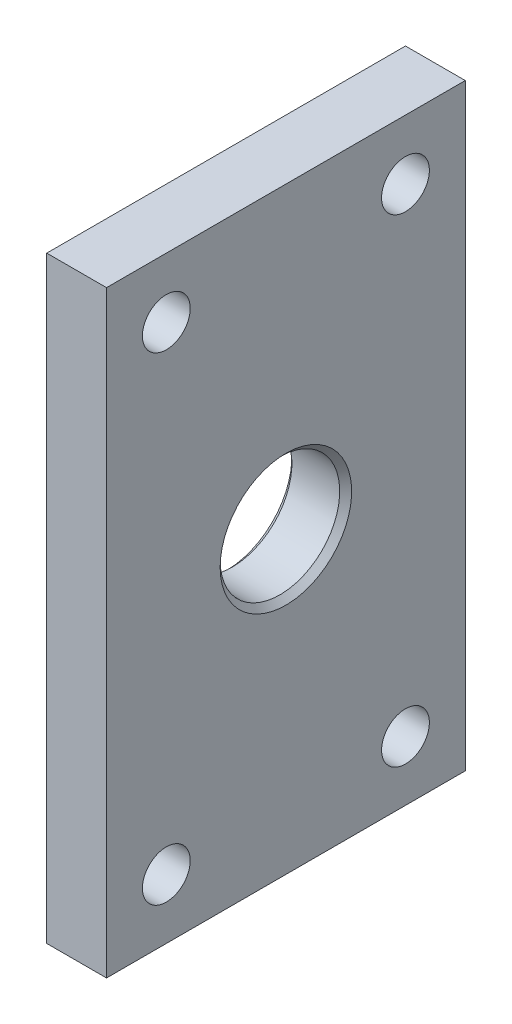
ISO-10303-21;
HEADER;
FILE_DESCRIPTION(('STEP AP214'),'2;1');
FILE_NAME('part.step','',(''),(''),'','','');
FILE_SCHEMA(('AUTOMOTIVE_DESIGN { 1 0 10303 214 1 1 1 1 }'));
ENDSEC;
DATA;
#1=APPLICATION_CONTEXT('core data for automotive mechanical design processes');
#2=APPLICATION_PROTOCOL_DEFINITION('international standard','automotive_design',2000,#1);
#3=PRODUCT_CONTEXT('',#1,'mechanical');
#4=PRODUCT('Part','Part','',(#3));
#5=PRODUCT_RELATED_PRODUCT_CATEGORY('part','',(#4));
#6=PRODUCT_DEFINITION_FORMATION('','',#4);
#7=PRODUCT_DEFINITION_CONTEXT('part definition',#1,'design');
#8=PRODUCT_DEFINITION('design','',#6,#7);
#9=PRODUCT_DEFINITION_SHAPE('','',#8);
#10=(LENGTH_UNIT() NAMED_UNIT(*) SI_UNIT(.MILLI.,.METRE.));
#11=(NAMED_UNIT(*) PLANE_ANGLE_UNIT() SI_UNIT($,.RADIAN.));
#12=(NAMED_UNIT(*) SI_UNIT($,.STERADIAN.) SOLID_ANGLE_UNIT());
#13=UNCERTAINTY_MEASURE_WITH_UNIT(LENGTH_MEASURE(1.E-05),#10,'distance_accuracy_value','');
#14=(GEOMETRIC_REPRESENTATION_CONTEXT(3) GLOBAL_UNCERTAINTY_ASSIGNED_CONTEXT((#13)) GLOBAL_UNIT_ASSIGNED_CONTEXT((#10,
#11,#12)) REPRESENTATION_CONTEXT('',''));
#15=CARTESIAN_POINT('',(0.,0.,0.));
#16=DIRECTION('',(0.,0.,1.));
#17=DIRECTION('',(1.,0.,0.));
#18=AXIS2_PLACEMENT_3D('',#15,#16,#17);
#19=CARTESIAN_POINT('',(10.,0.,0.));
#20=DIRECTION('',(0.,1.,0.));
#21=DIRECTION('',(0.,0.,1.));
#22=AXIS2_PLACEMENT_3D('',#19,#20,#21);
#23=PLANE('',#22);
#24=DIRECTION('',(0.,0.,-1.));
#25=VECTOR('',#24,1.);
#26=CARTESIAN_POINT('',(0.,0.,0.));
#27=LINE('',#26,#25);
#28=CARTESIAN_POINT('',(0.,0.,60.));
#29=VERTEX_POINT('',#28);
#30=CARTESIAN_POINT('',(0.,0.,0.));
#31=VERTEX_POINT('',#30);
#32=EDGE_CURVE('E110',#29,#31,#27,.T.);
#33=ORIENTED_EDGE('',*,*,#32,.T.);
#34=DIRECTION('',(-1.,0.,0.));
#35=VECTOR('',#34,1.);
#36=CARTESIAN_POINT('',(10.,0.,0.));
#37=LINE('',#36,#35);
#38=CARTESIAN_POINT('',(10.,0.,0.));
#39=VERTEX_POINT('',#38);
#40=EDGE_CURVE('E101',#39,#31,#37,.T.);
#41=ORIENTED_EDGE('',*,*,#40,.F.);
#42=DIRECTION('',(0.,0.,-1.));
#43=VECTOR('',#42,1.);
#44=CARTESIAN_POINT('',(10.,0.,0.));
#45=LINE('',#44,#43);
#46=CARTESIAN_POINT('',(10.,0.,60.));
#47=VERTEX_POINT('',#46);
#48=EDGE_CURVE('E95',#47,#39,#45,.T.);
#49=ORIENTED_EDGE('',*,*,#48,.F.);
#50=DIRECTION('',(-1.,0.,0.));
#51=VECTOR('',#50,1.);
#52=CARTESIAN_POINT('',(10.,0.,60.));
#53=LINE('',#52,#51);
#54=EDGE_CURVE('E106',#47,#29,#53,.T.);
#55=ORIENTED_EDGE('',*,*,#54,.T.);
#56=EDGE_LOOP('',(#33,#41,#49,#55));
#57=FACE_BOUND('',#56,.T.);
#58=ADVANCED_FACE('F41',(#57),#23,.F.);
#59=CARTESIAN_POINT('',(10.,0.,0.));
#60=DIRECTION('',(0.,0.,1.));
#61=DIRECTION('',(1.,0.,0.));
#62=AXIS2_PLACEMENT_3D('',#59,#60,#61);
#63=PLANE('',#62);
#64=DIRECTION('',(0.,1.,0.));
#65=VECTOR('',#64,1.);
#66=CARTESIAN_POINT('',(0.,0.,0.));
#67=LINE('',#66,#65);
#68=CARTESIAN_POINT('',(0.,100.,0.));
#69=VERTEX_POINT('',#68);
#70=EDGE_CURVE('E100',#31,#69,#67,.T.);
#71=ORIENTED_EDGE('',*,*,#70,.T.);
#72=DIRECTION('',(-1.,0.,0.));
#73=VECTOR('',#72,1.);
#74=CARTESIAN_POINT('',(10.,100.,0.));
#75=LINE('',#74,#73);
#76=CARTESIAN_POINT('',(10.,100.,0.));
#77=VERTEX_POINT('',#76);
#78=EDGE_CURVE('E98',#77,#69,#75,.T.);
#79=ORIENTED_EDGE('',*,*,#78,.F.);
#80=DIRECTION('',(0.,1.,0.));
#81=VECTOR('',#80,1.);
#82=CARTESIAN_POINT('',(10.,0.,0.));
#83=LINE('',#82,#81);
#84=EDGE_CURVE('E90',#39,#77,#83,.T.);
#85=ORIENTED_EDGE('',*,*,#84,.F.);
#86=ORIENTED_EDGE('',*,*,#40,.T.);
#87=EDGE_LOOP('',(#71,#79,#85,#86));
#88=FACE_BOUND('',#87,.T.);
#89=ADVANCED_FACE('F99',(#88),#63,.F.);
#90=CARTESIAN_POINT('',(10.,100.,0.));
#91=DIRECTION('',(0.,-1.,0.));
#92=DIRECTION('',(0.,0.,-1.));
#93=AXIS2_PLACEMENT_3D('',#90,#91,#92);
#94=PLANE('',#93);
#95=DIRECTION('',(0.,0.,1.));
#96=VECTOR('',#95,1.);
#97=CARTESIAN_POINT('',(0.,100.,0.));
#98=LINE('',#97,#96);
#99=CARTESIAN_POINT('',(0.,100.,60.));
#100=VERTEX_POINT('',#99);
#101=EDGE_CURVE('E76',#69,#100,#98,.T.);
#102=ORIENTED_EDGE('',*,*,#101,.T.);
#103=DIRECTION('',(-1.,0.,0.));
#104=VECTOR('',#103,1.);
#105=CARTESIAN_POINT('',(10.,100.,60.));
#106=LINE('',#105,#104);
#107=CARTESIAN_POINT('',(10.,100.,60.));
#108=VERTEX_POINT('',#107);
#109=EDGE_CURVE('E102',#108,#100,#106,.T.);
#110=ORIENTED_EDGE('',*,*,#109,.F.);
#111=DIRECTION('',(0.,0.,1.));
#112=VECTOR('',#111,1.);
#113=CARTESIAN_POINT('',(10.,100.,0.));
#114=LINE('',#113,#112);
#115=EDGE_CURVE('E93',#77,#108,#114,.T.);
#116=ORIENTED_EDGE('',*,*,#115,.F.);
#117=ORIENTED_EDGE('',*,*,#78,.T.);
#118=EDGE_LOOP('',(#102,#110,#116,#117));
#119=FACE_BOUND('',#118,.T.);
#120=ADVANCED_FACE('F104',(#119),#94,.F.);
#121=CARTESIAN_POINT('',(10.,0.,60.));
#122=DIRECTION('',(0.,0.,-1.));
#123=DIRECTION('',(-1.,0.,0.));
#124=AXIS2_PLACEMENT_3D('',#121,#122,#123);
#125=PLANE('',#124);
#126=DIRECTION('',(0.,-1.,0.));
#127=VECTOR('',#126,1.);
#128=CARTESIAN_POINT('',(0.,0.,60.));
#129=LINE('',#128,#127);
#130=EDGE_CURVE('E82',#100,#29,#129,.T.);
#131=ORIENTED_EDGE('',*,*,#130,.T.);
#132=ORIENTED_EDGE('',*,*,#54,.F.);
#133=DIRECTION('',(0.,-1.,0.));
#134=VECTOR('',#133,1.);
#135=CARTESIAN_POINT('',(10.,0.,60.));
#136=LINE('',#135,#134);
#137=EDGE_CURVE('E59',#108,#47,#136,.T.);
#138=ORIENTED_EDGE('',*,*,#137,.F.);
#139=ORIENTED_EDGE('',*,*,#109,.T.);
#140=EDGE_LOOP('',(#131,#132,#138,#139));
#141=FACE_BOUND('',#140,.T.);
#142=ADVANCED_FACE('F159',(#141),#125,.F.);
#143=CARTESIAN_POINT('',(10.,0.,0.));
#144=DIRECTION('',(-1.,0.,0.));
#145=DIRECTION('',(0.,0.,1.));
#146=AXIS2_PLACEMENT_3D('',#143,#144,#145);
#147=PLANE('',#146);
#148=CARTESIAN_POINT('',(10.,50.,30.));
#149=DIRECTION('',(-1.,0.,0.));
#150=DIRECTION('',(0.,0.,1.));
#151=AXIS2_PLACEMENT_3D('',#148,#149,#150);
#152=CIRCLE('',#151,11.);
#153=CARTESIAN_POINT('',(10.,50.,41.));
#154=VERTEX_POINT('',#153);
#155=EDGE_CURVE('E11',#154,#154,#152,.T.);
#156=ORIENTED_EDGE('',*,*,#155,.T.);
#157=EDGE_LOOP('',(#156));
#158=FACE_BOUND('',#157,.T.);
#159=CARTESIAN_POINT('',(10.,90.,10.));
#160=DIRECTION('',(1.,0.,0.));
#161=DIRECTION('',(0.,0.,-1.));
#162=AXIS2_PLACEMENT_3D('',#159,#160,#161);
#163=CIRCLE('',#162,4.00000000000001);
#164=CARTESIAN_POINT('',(10.,90.,5.99999999999999));
#165=VERTEX_POINT('',#164);
#166=EDGE_CURVE('E275',#165,#165,#163,.T.);
#167=ORIENTED_EDGE('',*,*,#166,.F.);
#168=EDGE_LOOP('',(#167));
#169=FACE_BOUND('',#168,.T.);
#170=CARTESIAN_POINT('',(10.,10.,50.));
#171=DIRECTION('',(1.,0.,0.));
#172=DIRECTION('',(0.,0.,-1.));
#173=AXIS2_PLACEMENT_3D('',#170,#171,#172);
#174=CIRCLE('',#173,4.);
#175=CARTESIAN_POINT('',(10.,10.,46.));
#176=VERTEX_POINT('',#175);
#177=EDGE_CURVE('E279',#176,#176,#174,.T.);
#178=ORIENTED_EDGE('',*,*,#177,.F.);
#179=EDGE_LOOP('',(#178));
#180=FACE_BOUND('',#179,.T.);
#181=CARTESIAN_POINT('',(10.,90.,50.));
#182=DIRECTION('',(1.,0.,0.));
#183=DIRECTION('',(0.,0.,-1.));
#184=AXIS2_PLACEMENT_3D('',#181,#182,#183);
#185=CIRCLE('',#184,4.00000000000001);
#186=CARTESIAN_POINT('',(10.,90.,46.));
#187=VERTEX_POINT('',#186);
#188=EDGE_CURVE('E283',#187,#187,#185,.T.);
#189=ORIENTED_EDGE('',*,*,#188,.F.);
#190=EDGE_LOOP('',(#189));
#191=FACE_BOUND('',#190,.T.);
#192=CARTESIAN_POINT('',(10.,10.,10.));
#193=DIRECTION('',(1.,0.,0.));
#194=DIRECTION('',(0.,0.,-1.));
#195=AXIS2_PLACEMENT_3D('',#192,#193,#194);
#196=CIRCLE('',#195,4.);
#197=CARTESIAN_POINT('',(10.,10.,6.));
#198=VERTEX_POINT('',#197);
#199=EDGE_CURVE('E113',#198,#198,#196,.T.);
#200=ORIENTED_EDGE('',*,*,#199,.F.);
#201=EDGE_LOOP('',(#200));
#202=FACE_BOUND('',#201,.T.);
#203=ORIENTED_EDGE('',*,*,#48,.T.);
#204=ORIENTED_EDGE('',*,*,#84,.T.);
#205=ORIENTED_EDGE('',*,*,#115,.T.);
#206=ORIENTED_EDGE('',*,*,#137,.T.);
#207=EDGE_LOOP('',(#203,#204,#205,#206));
#208=FACE_BOUND('',#207,.T.);
#209=ADVANCED_FACE('F91',(#158,#169,#180,#191,#202,#208),#147,.F.);
#210=CARTESIAN_POINT('',(0.,0.,0.));
#211=DIRECTION('',(-1.,0.,0.));
#212=DIRECTION('',(0.,0.,1.));
#213=AXIS2_PLACEMENT_3D('',#210,#211,#212);
#214=PLANE('',#213);
#215=CARTESIAN_POINT('',(0.,50.,30.));
#216=DIRECTION('',(-1.,0.,0.));
#217=DIRECTION('',(0.,0.,1.));
#218=AXIS2_PLACEMENT_3D('',#215,#216,#217);
#219=CIRCLE('',#218,11.);
#220=CARTESIAN_POINT('',(0.,50.,41.));
#221=VERTEX_POINT('',#220);
#222=EDGE_CURVE('E120',#221,#221,#219,.F.);
#223=ORIENTED_EDGE('',*,*,#222,.T.);
#224=EDGE_LOOP('',(#223));
#225=FACE_BOUND('',#224,.T.);
#226=CARTESIAN_POINT('',(0.,90.,10.));
#227=DIRECTION('',(1.,0.,0.));
#228=DIRECTION('',(0.,0.,-1.));
#229=AXIS2_PLACEMENT_3D('',#226,#227,#228);
#230=CIRCLE('',#229,4.00000000000001);
#231=CARTESIAN_POINT('',(0.,90.,5.99999999999999));
#232=VERTEX_POINT('',#231);
#233=EDGE_CURVE('E144',#232,#232,#230,.T.);
#234=ORIENTED_EDGE('',*,*,#233,.T.);
#235=EDGE_LOOP('',(#234));
#236=FACE_BOUND('',#235,.T.);
#237=CARTESIAN_POINT('',(0.,10.,50.));
#238=DIRECTION('',(1.,0.,0.));
#239=DIRECTION('',(0.,0.,-1.));
#240=AXIS2_PLACEMENT_3D('',#237,#238,#239);
#241=CIRCLE('',#240,4.);
#242=CARTESIAN_POINT('',(0.,10.,46.));
#243=VERTEX_POINT('',#242);
#244=EDGE_CURVE('E148',#243,#243,#241,.T.);
#245=ORIENTED_EDGE('',*,*,#244,.T.);
#246=EDGE_LOOP('',(#245));
#247=FACE_BOUND('',#246,.T.);
#248=CARTESIAN_POINT('',(0.,90.,50.));
#249=DIRECTION('',(1.,0.,0.));
#250=DIRECTION('',(0.,0.,-1.));
#251=AXIS2_PLACEMENT_3D('',#248,#249,#250);
#252=CIRCLE('',#251,4.00000000000001);
#253=CARTESIAN_POINT('',(0.,90.,46.));
#254=VERTEX_POINT('',#253);
#255=EDGE_CURVE('E152',#254,#254,#252,.T.);
#256=ORIENTED_EDGE('',*,*,#255,.T.);
#257=EDGE_LOOP('',(#256));
#258=FACE_BOUND('',#257,.T.);
#259=CARTESIAN_POINT('',(0.,10.,10.));
#260=DIRECTION('',(1.,0.,0.));
#261=DIRECTION('',(0.,0.,-1.));
#262=AXIS2_PLACEMENT_3D('',#259,#260,#261);
#263=CIRCLE('',#262,4.);
#264=CARTESIAN_POINT('',(0.,10.,6.));
#265=VERTEX_POINT('',#264);
#266=EDGE_CURVE('E156',#265,#265,#263,.T.);
#267=ORIENTED_EDGE('',*,*,#266,.T.);
#268=EDGE_LOOP('',(#267));
#269=FACE_BOUND('',#268,.T.);
#270=ORIENTED_EDGE('',*,*,#32,.F.);
#271=ORIENTED_EDGE('',*,*,#130,.F.);
#272=ORIENTED_EDGE('',*,*,#101,.F.);
#273=ORIENTED_EDGE('',*,*,#70,.F.);
#274=EDGE_LOOP('',(#270,#271,#272,#273));
#275=FACE_BOUND('',#274,.T.);
#276=ADVANCED_FACE('F136',(#225,#236,#247,#258,#269,#275),#214,.T.);
#277=CARTESIAN_POINT('',(10.,10.,10.));
#278=DIRECTION('',(-1.,0.,0.));
#279=DIRECTION('',(0.,0.,1.));
#280=AXIS2_PLACEMENT_3D('',#277,#278,#279);
#281=CYLINDRICAL_SURFACE('',#280,4.);
#282=ORIENTED_EDGE('',*,*,#199,.T.);
#283=EDGE_LOOP('',(#282));
#284=FACE_BOUND('',#283,.T.);
#285=ORIENTED_EDGE('',*,*,#266,.F.);
#286=EDGE_LOOP('',(#285));
#287=FACE_BOUND('',#286,.T.);
#288=ADVANCED_FACE('F139',(#284,#287),#281,.F.);
#289=CARTESIAN_POINT('',(10.,90.,50.));
#290=DIRECTION('',(-1.,0.,0.));
#291=DIRECTION('',(0.,0.,1.));
#292=AXIS2_PLACEMENT_3D('',#289,#290,#291);
#293=CYLINDRICAL_SURFACE('',#292,4.00000000000001);
#294=ORIENTED_EDGE('',*,*,#188,.T.);
#295=EDGE_LOOP('',(#294));
#296=FACE_BOUND('',#295,.T.);
#297=ORIENTED_EDGE('',*,*,#255,.F.);
#298=EDGE_LOOP('',(#297));
#299=FACE_BOUND('',#298,.T.);
#300=ADVANCED_FACE('F215',(#296,#299),#293,.F.);
#301=CARTESIAN_POINT('',(10.,10.,50.));
#302=DIRECTION('',(-1.,0.,0.));
#303=DIRECTION('',(0.,0.,1.));
#304=AXIS2_PLACEMENT_3D('',#301,#302,#303);
#305=CYLINDRICAL_SURFACE('',#304,4.);
#306=ORIENTED_EDGE('',*,*,#177,.T.);
#307=EDGE_LOOP('',(#306));
#308=FACE_BOUND('',#307,.T.);
#309=ORIENTED_EDGE('',*,*,#244,.F.);
#310=EDGE_LOOP('',(#309));
#311=FACE_BOUND('',#310,.T.);
#312=ADVANCED_FACE('F225',(#308,#311),#305,.F.);
#313=CARTESIAN_POINT('',(10.,90.,10.));
#314=DIRECTION('',(-1.,0.,0.));
#315=DIRECTION('',(0.,0.,1.));
#316=AXIS2_PLACEMENT_3D('',#313,#314,#315);
#317=CYLINDRICAL_SURFACE('',#316,4.00000000000001);
#318=ORIENTED_EDGE('',*,*,#166,.T.);
#319=EDGE_LOOP('',(#318));
#320=FACE_BOUND('',#319,.T.);
#321=ORIENTED_EDGE('',*,*,#233,.F.);
#322=EDGE_LOOP('',(#321));
#323=FACE_BOUND('',#322,.T.);
#324=ADVANCED_FACE('F235',(#320,#323),#317,.F.);
#325=CARTESIAN_POINT('',(10.,50.,30.));
#326=DIRECTION('',(-1.,0.,0.));
#327=DIRECTION('',(0.,0.,1.));
#328=AXIS2_PLACEMENT_3D('',#325,#326,#327);
#329=CYLINDRICAL_SURFACE('',#328,10.);
#330=CARTESIAN_POINT('',(1.00000000000002,50.,30.));
#331=DIRECTION('',(-1.,0.,0.));
#332=DIRECTION('',(0.,0.,1.));
#333=AXIS2_PLACEMENT_3D('',#330,#331,#332);
#334=CIRCLE('',#333,10.);
#335=CARTESIAN_POINT('',(1.00000000000002,50.,40.));
#336=VERTEX_POINT('',#335);
#337=EDGE_CURVE('E51',#336,#336,#334,.T.);
#338=ORIENTED_EDGE('',*,*,#337,.T.);
#339=EDGE_LOOP('',(#338));
#340=FACE_BOUND('',#339,.T.);
#341=CARTESIAN_POINT('',(9.00000000000001,50.,30.));
#342=DIRECTION('',(-1.,0.,0.));
#343=DIRECTION('',(0.,0.,1.));
#344=AXIS2_PLACEMENT_3D('',#341,#342,#343);
#345=CIRCLE('',#344,10.);
#346=CARTESIAN_POINT('',(9.00000000000001,50.,40.));
#347=VERTEX_POINT('',#346);
#348=EDGE_CURVE('E123',#347,#347,#345,.F.);
#349=ORIENTED_EDGE('',*,*,#348,.T.);
#350=EDGE_LOOP('',(#349));
#351=FACE_BOUND('',#350,.T.);
#352=ADVANCED_FACE('F128',(#340,#351),#329,.F.);
#353=CARTESIAN_POINT('',(0.,50.,30.));
#354=DIRECTION('',(-1.,0.,0.));
#355=DIRECTION('',(0.,0.,1.));
#356=AXIS2_PLACEMENT_3D('',#353,#354,#355);
#357=CONICAL_SURFACE('',#356,11.,0.785398163397441);
#358=ORIENTED_EDGE('',*,*,#337,.F.);
#359=EDGE_LOOP('',(#358));
#360=FACE_BOUND('',#359,.T.);
#361=ORIENTED_EDGE('',*,*,#222,.F.);
#362=EDGE_LOOP('',(#361));
#363=FACE_BOUND('',#362,.T.);
#364=ADVANCED_FACE('F131',(#360,#363),#357,.F.);
#365=CARTESIAN_POINT('',(9.00000000000001,50.,30.));
#366=DIRECTION('',(1.,0.,0.));
#367=DIRECTION('',(0.,0.,-1.));
#368=AXIS2_PLACEMENT_3D('',#365,#366,#367);
#369=CONICAL_SURFACE('',#368,10.,0.785398163397455);
#370=ORIENTED_EDGE('',*,*,#155,.F.);
#371=EDGE_LOOP('',(#370));
#372=FACE_BOUND('',#371,.T.);
#373=ORIENTED_EDGE('',*,*,#348,.F.);
#374=EDGE_LOOP('',(#373));
#375=FACE_BOUND('',#374,.T.);
#376=ADVANCED_FACE('F44',(#372,#375),#369,.F.);
#377=CLOSED_SHELL('',(#58,#89,#120,#142,#209,#276,#288,#300,#312,#324,#352,#364,#376));
#378=MANIFOLD_SOLID_BREP('B2',#377);
#379=ADVANCED_BREP_SHAPE_REPRESENTATION('',(#18,#378),#14);
#380=SHAPE_DEFINITION_REPRESENTATION(#9,#379);
ENDSEC;
END-ISO-10303-21;
